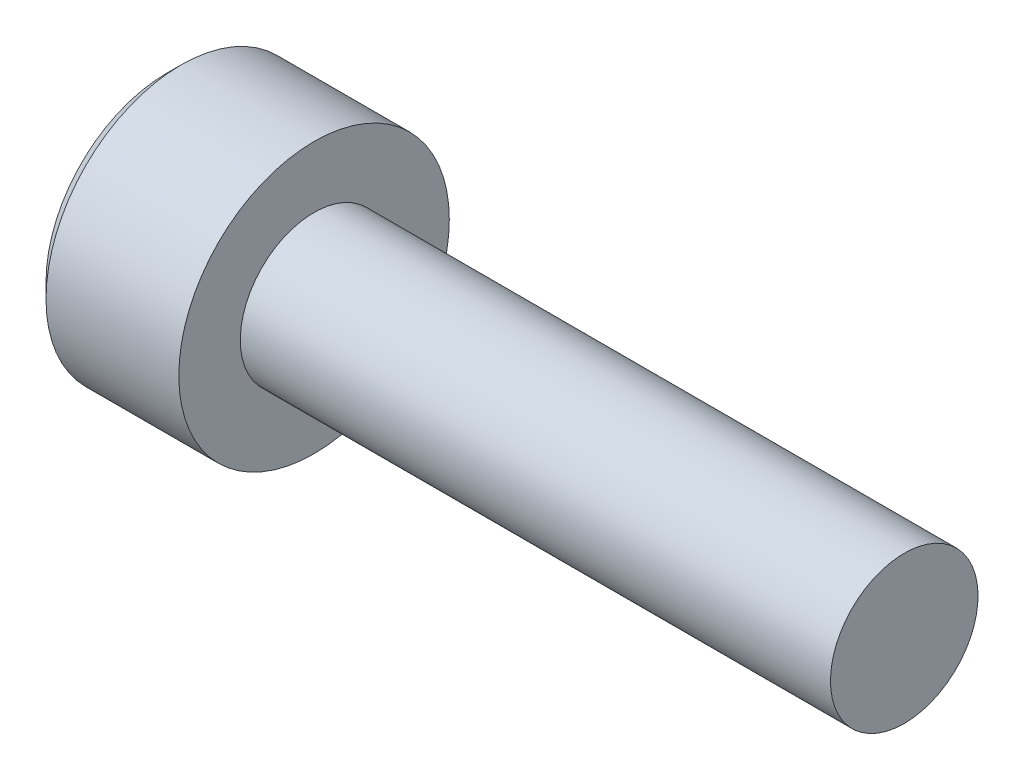
ISO-10303-21;
HEADER;
FILE_DESCRIPTION(('STEP AP214'),'2;1');
FILE_NAME('part.step','',(''),(''),'','','');
FILE_SCHEMA(('AUTOMOTIVE_DESIGN { 1 0 10303 214 1 1 1 1 }'));
ENDSEC;
DATA;
#1=APPLICATION_CONTEXT('core data for automotive mechanical design processes');
#2=APPLICATION_PROTOCOL_DEFINITION('international standard','automotive_design',2000,#1);
#3=PRODUCT_CONTEXT('',#1,'mechanical');
#4=PRODUCT('Part','Part','',(#3));
#5=PRODUCT_RELATED_PRODUCT_CATEGORY('part','',(#4));
#6=PRODUCT_DEFINITION_FORMATION('','',#4);
#7=PRODUCT_DEFINITION_CONTEXT('part definition',#1,'design');
#8=PRODUCT_DEFINITION('design','',#6,#7);
#9=PRODUCT_DEFINITION_SHAPE('','',#8);
#10=(LENGTH_UNIT() NAMED_UNIT(*) SI_UNIT(.MILLI.,.METRE.));
#11=(NAMED_UNIT(*) PLANE_ANGLE_UNIT() SI_UNIT($,.RADIAN.));
#12=(NAMED_UNIT(*) SI_UNIT($,.STERADIAN.) SOLID_ANGLE_UNIT());
#13=UNCERTAINTY_MEASURE_WITH_UNIT(LENGTH_MEASURE(1.E-05),#10,'distance_accuracy_value','');
#14=(GEOMETRIC_REPRESENTATION_CONTEXT(3) GLOBAL_UNCERTAINTY_ASSIGNED_CONTEXT((#13)) GLOBAL_UNIT_ASSIGNED_CONTEXT((#10,
#11,#12)) REPRESENTATION_CONTEXT('',''));
#15=CARTESIAN_POINT('',(0.,0.,0.));
#16=DIRECTION('',(0.,0.,1.));
#17=DIRECTION('',(1.,0.,0.));
#18=AXIS2_PLACEMENT_3D('',#15,#16,#17);
#19=CARTESIAN_POINT('',(-3.,0.,0.));
#20=DIRECTION('',(1.,0.,0.));
#21=DIRECTION('',(0.,1.,0.));
#22=AXIS2_PLACEMENT_3D('',#19,#20,#21);
#23=PLANE('',#22);
#24=CARTESIAN_POINT('',(-3.,0.,0.));
#25=DIRECTION('',(1.,0.,0.));
#26=DIRECTION('',(0.,1.,0.));
#27=AXIS2_PLACEMENT_3D('',#24,#25,#26);
#28=CIRCLE('',#27,2.45);
#29=CARTESIAN_POINT('',(-3.,2.45,0.));
#30=VERTEX_POINT('',#29);
#31=EDGE_CURVE('E45',#30,#30,#28,.F.);
#32=ORIENTED_EDGE('',*,*,#31,.T.);
#33=EDGE_LOOP('',(#32));
#34=FACE_BOUND('',#33,.T.);
#35=DIRECTION('',(0.,0.5,-0.866025403784439));
#36=VECTOR('',#35,1.);
#37=CARTESIAN_POINT('',(-3.,0.721687836487032,1.25));
#38=LINE('',#37,#36);
#39=CARTESIAN_POINT('',(-3.,0.721687836487031,1.25));
#40=VERTEX_POINT('',#39);
#41=CARTESIAN_POINT('',(-3.,1.44337567297406,0.));
#42=VERTEX_POINT('',#41);
#43=EDGE_CURVE('E150',#40,#42,#38,.T.);
#44=ORIENTED_EDGE('',*,*,#43,.F.);
#45=DIRECTION('',(0.,1.,0.));
#46=VECTOR('',#45,1.);
#47=CARTESIAN_POINT('',(-3.,-0.721687836487034,1.25));
#48=LINE('',#47,#46);
#49=CARTESIAN_POINT('',(-3.,-0.721687836487034,1.25));
#50=VERTEX_POINT('',#49);
#51=EDGE_CURVE('E123',#50,#40,#48,.T.);
#52=ORIENTED_EDGE('',*,*,#51,.F.);
#53=DIRECTION('',(0.,0.5,0.866025403784439));
#54=VECTOR('',#53,1.);
#55=CARTESIAN_POINT('',(-3.,-1.44337567297407,0.));
#56=LINE('',#55,#54);
#57=CARTESIAN_POINT('',(-3.,-1.44337567297407,0.));
#58=VERTEX_POINT('',#57);
#59=EDGE_CURVE('E119',#58,#50,#56,.T.);
#60=ORIENTED_EDGE('',*,*,#59,.F.);
#61=DIRECTION('',(0.,-0.5,0.866025403784439));
#62=VECTOR('',#61,1.);
#63=CARTESIAN_POINT('',(-3.,-0.721687836487033,-1.25));
#64=LINE('',#63,#62);
#65=CARTESIAN_POINT('',(-3.,-0.721687836487033,-1.25));
#66=VERTEX_POINT('',#65);
#67=EDGE_CURVE('E156',#66,#58,#64,.T.);
#68=ORIENTED_EDGE('',*,*,#67,.F.);
#69=DIRECTION('',(0.,-1.,0.));
#70=VECTOR('',#69,1.);
#71=CARTESIAN_POINT('',(-3.,0.721687836487032,-1.25));
#72=LINE('',#71,#70);
#73=CARTESIAN_POINT('',(-3.,0.721687836487032,-1.25));
#74=VERTEX_POINT('',#73);
#75=EDGE_CURVE('E154',#74,#66,#72,.T.);
#76=ORIENTED_EDGE('',*,*,#75,.F.);
#77=DIRECTION('',(0.,-0.5,-0.866025403784439));
#78=VECTOR('',#77,1.);
#79=CARTESIAN_POINT('',(-3.,1.44337567297406,0.));
#80=LINE('',#79,#78);
#81=EDGE_CURVE('E152',#42,#74,#80,.T.);
#82=ORIENTED_EDGE('',*,*,#81,.F.);
#83=EDGE_LOOP('',(#44,#52,#60,#68,#76,#82));
#84=FACE_BOUND('',#83,.T.);
#85=ADVANCED_FACE('F37',(#34,#84),#23,.F.);
#86=CARTESIAN_POINT('',(0.,1.5,0.));
#87=DIRECTION('',(-1.,0.,0.));
#88=DIRECTION('',(0.,-1.,0.));
#89=AXIS2_PLACEMENT_3D('',#86,#87,#88);
#90=PLANE('',#89);
#91=CARTESIAN_POINT('',(0.,0.,0.));
#92=DIRECTION('',(-1.,0.,0.));
#93=DIRECTION('',(0.,-1.,0.));
#94=AXIS2_PLACEMENT_3D('',#91,#92,#93);
#95=CIRCLE('',#94,2.75);
#96=CARTESIAN_POINT('',(0.,-2.75,0.));
#97=VERTEX_POINT('',#96);
#98=EDGE_CURVE('E182',#97,#97,#95,.T.);
#99=ORIENTED_EDGE('',*,*,#98,.F.);
#100=EDGE_LOOP('',(#99));
#101=FACE_BOUND('',#100,.T.);
#102=CARTESIAN_POINT('',(0.,0.,0.));
#103=DIRECTION('',(-1.,0.,0.));
#104=DIRECTION('',(0.,-1.,0.));
#105=AXIS2_PLACEMENT_3D('',#102,#103,#104);
#106=CIRCLE('',#105,1.5);
#107=CARTESIAN_POINT('',(0.,-1.5,0.));
#108=VERTEX_POINT('',#107);
#109=EDGE_CURVE('E176',#108,#108,#106,.T.);
#110=ORIENTED_EDGE('',*,*,#109,.T.);
#111=EDGE_LOOP('',(#110));
#112=FACE_BOUND('',#111,.T.);
#113=ADVANCED_FACE('F200',(#101,#112),#90,.F.);
#114=CARTESIAN_POINT('',(-3.,0.,0.));
#115=DIRECTION('',(-1.,0.,0.));
#116=DIRECTION('',(0.,-1.,0.));
#117=AXIS2_PLACEMENT_3D('',#114,#115,#116);
#118=CYLINDRICAL_SURFACE('',#117,2.75);
#119=CARTESIAN_POINT('',(-2.7,0.,0.));
#120=DIRECTION('',(1.,0.,0.));
#121=DIRECTION('',(0.,1.,0.));
#122=AXIS2_PLACEMENT_3D('',#119,#120,#121);
#123=CIRCLE('',#122,2.75);
#124=CARTESIAN_POINT('',(-2.7,2.75,0.));
#125=VERTEX_POINT('',#124);
#126=EDGE_CURVE('E11',#125,#125,#123,.T.);
#127=ORIENTED_EDGE('',*,*,#126,.T.);
#128=EDGE_LOOP('',(#127));
#129=FACE_BOUND('',#128,.T.);
#130=ORIENTED_EDGE('',*,*,#98,.T.);
#131=EDGE_LOOP('',(#130));
#132=FACE_BOUND('',#131,.T.);
#133=ADVANCED_FACE('F205',(#129,#132),#118,.T.);
#134=CARTESIAN_POINT('',(12.,1.5,0.));
#135=DIRECTION('',(-1.,0.,0.));
#136=DIRECTION('',(0.,-1.,0.));
#137=AXIS2_PLACEMENT_3D('',#134,#135,#136);
#138=PLANE('',#137);
#139=CARTESIAN_POINT('',(12.,0.,0.));
#140=DIRECTION('',(-1.,0.,0.));
#141=DIRECTION('',(0.,-1.,0.));
#142=AXIS2_PLACEMENT_3D('',#139,#140,#141);
#143=CIRCLE('',#142,1.5);
#144=CARTESIAN_POINT('',(12.,-1.5,0.));
#145=VERTEX_POINT('',#144);
#146=EDGE_CURVE('E179',#145,#145,#143,.T.);
#147=ORIENTED_EDGE('',*,*,#146,.F.);
#148=EDGE_LOOP('',(#147));
#149=FACE_BOUND('',#148,.T.);
#150=ADVANCED_FACE('F209',(#149),#138,.F.);
#151=CARTESIAN_POINT('',(-3.,0.,0.));
#152=DIRECTION('',(-1.,0.,0.));
#153=DIRECTION('',(0.,-1.,0.));
#154=AXIS2_PLACEMENT_3D('',#151,#152,#153);
#155=CYLINDRICAL_SURFACE('',#154,1.5);
#156=ORIENTED_EDGE('',*,*,#109,.F.);
#157=EDGE_LOOP('',(#156));
#158=FACE_BOUND('',#157,.T.);
#159=ORIENTED_EDGE('',*,*,#146,.T.);
#160=EDGE_LOOP('',(#159));
#161=FACE_BOUND('',#160,.T.);
#162=ADVANCED_FACE('F216',(#158,#161),#155,.T.);
#163=CARTESIAN_POINT('',(-1.7,-0.721687836487034,1.25));
#164=DIRECTION('',(0.,0.,1.));
#165=DIRECTION('',(0.,-1.,0.));
#166=AXIS2_PLACEMENT_3D('',#163,#164,#165);
#167=PLANE('',#166);
#168=DIRECTION('',(0.,1.,0.));
#169=VECTOR('',#168,1.);
#170=CARTESIAN_POINT('',(-1.7,-0.721687836487034,1.25));
#171=LINE('',#170,#169);
#172=CARTESIAN_POINT('',(-1.7,-0.721687836487034,1.25));
#173=VERTEX_POINT('',#172);
#174=CARTESIAN_POINT('',(-1.7,0.,1.25));
#175=VERTEX_POINT('',#174);
#176=EDGE_CURVE('E60',#173,#175,#171,.T.);
#177=ORIENTED_EDGE('',*,*,#176,.F.);
#178=DIRECTION('',(-1.,0.,0.));
#179=VECTOR('',#178,1.);
#180=CARTESIAN_POINT('',(-1.7,-0.721687836487034,1.25));
#181=LINE('',#180,#179);
#182=EDGE_CURVE('E160',#173,#50,#181,.T.);
#183=ORIENTED_EDGE('',*,*,#182,.T.);
#184=ORIENTED_EDGE('',*,*,#51,.T.);
#185=DIRECTION('',(-1.,0.,0.));
#186=VECTOR('',#185,1.);
#187=CARTESIAN_POINT('',(-1.7,0.721687836487032,1.25));
#188=LINE('',#187,#186);
#189=CARTESIAN_POINT('',(-1.7,0.721687836487032,1.25));
#190=VERTEX_POINT('',#189);
#191=EDGE_CURVE('E52',#190,#40,#188,.T.);
#192=ORIENTED_EDGE('',*,*,#191,.F.);
#193=EDGE_CURVE('E112',#175,#190,#171,.T.);
#194=ORIENTED_EDGE('',*,*,#193,.F.);
#195=EDGE_LOOP('',(#177,#183,#184,#192,#194));
#196=FACE_BOUND('',#195,.T.);
#197=ADVANCED_FACE('F121',(#196),#167,.F.);
#198=CARTESIAN_POINT('',(-1.7,-1.44337567297407,0.));
#199=DIRECTION('',(0.,-0.866025403784439,0.5));
#200=DIRECTION('',(0.,-0.5,-0.866025403784439));
#201=AXIS2_PLACEMENT_3D('',#198,#199,#200);
#202=PLANE('',#201);
#203=DIRECTION('',(0.,0.5,0.866025403784439));
#204=VECTOR('',#203,1.);
#205=CARTESIAN_POINT('',(-1.7,-1.44337567297407,0.));
#206=LINE('',#205,#204);
#207=CARTESIAN_POINT('',(-1.7,-1.44337567297407,0.));
#208=VERTEX_POINT('',#207);
#209=CARTESIAN_POINT('',(-1.7,-1.08253175473055,0.625000000000001));
#210=VERTEX_POINT('',#209);
#211=EDGE_CURVE('E126',#208,#210,#206,.T.);
#212=ORIENTED_EDGE('',*,*,#211,.F.);
#213=DIRECTION('',(-1.,0.,0.));
#214=VECTOR('',#213,1.);
#215=CARTESIAN_POINT('',(-1.7,-1.44337567297407,0.));
#216=LINE('',#215,#214);
#217=EDGE_CURVE('E163',#208,#58,#216,.T.);
#218=ORIENTED_EDGE('',*,*,#217,.T.);
#219=ORIENTED_EDGE('',*,*,#59,.T.);
#220=ORIENTED_EDGE('',*,*,#182,.F.);
#221=EDGE_CURVE('E146',#210,#173,#206,.T.);
#222=ORIENTED_EDGE('',*,*,#221,.F.);
#223=EDGE_LOOP('',(#212,#218,#219,#220,#222));
#224=FACE_BOUND('',#223,.T.);
#225=ADVANCED_FACE('F229',(#224),#202,.F.);
#226=CARTESIAN_POINT('',(-1.7,-0.721687836487033,-1.25));
#227=DIRECTION('',(0.,-0.866025403784439,-0.5));
#228=DIRECTION('',(0.,0.5,-0.866025403784439));
#229=AXIS2_PLACEMENT_3D('',#226,#227,#228);
#230=PLANE('',#229);
#231=DIRECTION('',(0.,-0.5,0.866025403784439));
#232=VECTOR('',#231,1.);
#233=CARTESIAN_POINT('',(-1.7,-0.721687836487033,-1.25));
#234=LINE('',#233,#232);
#235=CARTESIAN_POINT('',(-1.7,-0.721687836487033,-1.25));
#236=VERTEX_POINT('',#235);
#237=CARTESIAN_POINT('',(-1.7,-1.08253175473055,-0.625));
#238=VERTEX_POINT('',#237);
#239=EDGE_CURVE('E143',#236,#238,#234,.T.);
#240=ORIENTED_EDGE('',*,*,#239,.F.);
#241=DIRECTION('',(-1.,0.,0.));
#242=VECTOR('',#241,1.);
#243=CARTESIAN_POINT('',(-1.7,-0.721687836487033,-1.25));
#244=LINE('',#243,#242);
#245=EDGE_CURVE('E166',#236,#66,#244,.T.);
#246=ORIENTED_EDGE('',*,*,#245,.T.);
#247=ORIENTED_EDGE('',*,*,#67,.T.);
#248=ORIENTED_EDGE('',*,*,#217,.F.);
#249=EDGE_CURVE('E142',#238,#208,#234,.T.);
#250=ORIENTED_EDGE('',*,*,#249,.F.);
#251=EDGE_LOOP('',(#240,#246,#247,#248,#250));
#252=FACE_BOUND('',#251,.T.);
#253=ADVANCED_FACE('F241',(#252),#230,.F.);
#254=CARTESIAN_POINT('',(-1.7,0.721687836487032,-1.25));
#255=DIRECTION('',(0.,0.,-1.));
#256=DIRECTION('',(-1.,0.,0.));
#257=AXIS2_PLACEMENT_3D('',#254,#255,#256);
#258=PLANE('',#257);
#259=DIRECTION('',(0.,-1.,0.));
#260=VECTOR('',#259,1.);
#261=CARTESIAN_POINT('',(-1.7,0.721687836487032,-1.25));
#262=LINE('',#261,#260);
#263=CARTESIAN_POINT('',(-1.7,0.721687836487032,-1.25));
#264=VERTEX_POINT('',#263);
#265=CARTESIAN_POINT('',(-1.7,0.,-1.25));
#266=VERTEX_POINT('',#265);
#267=EDGE_CURVE('E139',#264,#266,#262,.T.);
#268=ORIENTED_EDGE('',*,*,#267,.F.);
#269=DIRECTION('',(-1.,0.,0.));
#270=VECTOR('',#269,1.);
#271=CARTESIAN_POINT('',(-1.7,0.721687836487032,-1.25));
#272=LINE('',#271,#270);
#273=EDGE_CURVE('E169',#264,#74,#272,.T.);
#274=ORIENTED_EDGE('',*,*,#273,.T.);
#275=ORIENTED_EDGE('',*,*,#75,.T.);
#276=ORIENTED_EDGE('',*,*,#245,.F.);
#277=EDGE_CURVE('E138',#266,#236,#262,.T.);
#278=ORIENTED_EDGE('',*,*,#277,.F.);
#279=EDGE_LOOP('',(#268,#274,#275,#276,#278));
#280=FACE_BOUND('',#279,.T.);
#281=ADVANCED_FACE('F237',(#280),#258,.F.);
#282=CARTESIAN_POINT('',(-1.7,1.44337567297406,0.));
#283=DIRECTION('',(0.,0.866025403784439,-0.5));
#284=DIRECTION('',(0.,0.5,0.866025403784439));
#285=AXIS2_PLACEMENT_3D('',#282,#283,#284);
#286=PLANE('',#285);
#287=DIRECTION('',(0.,-0.5,-0.866025403784439));
#288=VECTOR('',#287,1.);
#289=CARTESIAN_POINT('',(-1.7,1.44337567297406,0.));
#290=LINE('',#289,#288);
#291=CARTESIAN_POINT('',(-1.7,1.44337567297406,0.));
#292=VERTEX_POINT('',#291);
#293=CARTESIAN_POINT('',(-1.7,1.08253175473055,-0.625));
#294=VERTEX_POINT('',#293);
#295=EDGE_CURVE('E134',#292,#294,#290,.T.);
#296=ORIENTED_EDGE('',*,*,#295,.F.);
#297=DIRECTION('',(-1.,0.,0.));
#298=VECTOR('',#297,1.);
#299=CARTESIAN_POINT('',(-1.7,1.44337567297406,0.));
#300=LINE('',#299,#298);
#301=EDGE_CURVE('E125',#292,#42,#300,.T.);
#302=ORIENTED_EDGE('',*,*,#301,.T.);
#303=ORIENTED_EDGE('',*,*,#81,.T.);
#304=ORIENTED_EDGE('',*,*,#273,.F.);
#305=EDGE_CURVE('E132',#294,#264,#290,.T.);
#306=ORIENTED_EDGE('',*,*,#305,.F.);
#307=EDGE_LOOP('',(#296,#302,#303,#304,#306));
#308=FACE_BOUND('',#307,.T.);
#309=ADVANCED_FACE('F234',(#308),#286,.F.);
#310=CARTESIAN_POINT('',(-1.7,0.721687836487032,1.25));
#311=DIRECTION('',(0.,0.866025403784439,0.5));
#312=DIRECTION('',(0.,-0.5,0.866025403784439));
#313=AXIS2_PLACEMENT_3D('',#310,#311,#312);
#314=PLANE('',#313);
#315=DIRECTION('',(0.,0.5,-0.866025403784439));
#316=VECTOR('',#315,1.);
#317=CARTESIAN_POINT('',(-1.7,0.721687836487032,1.25));
#318=LINE('',#317,#316);
#319=CARTESIAN_POINT('',(-1.7,1.08253175473055,0.625));
#320=VERTEX_POINT('',#319);
#321=EDGE_CURVE('E114',#190,#320,#318,.T.);
#322=ORIENTED_EDGE('',*,*,#321,.F.);
#323=ORIENTED_EDGE('',*,*,#191,.T.);
#324=ORIENTED_EDGE('',*,*,#43,.T.);
#325=ORIENTED_EDGE('',*,*,#301,.F.);
#326=EDGE_CURVE('E131',#320,#292,#318,.T.);
#327=ORIENTED_EDGE('',*,*,#326,.F.);
#328=EDGE_LOOP('',(#322,#323,#324,#325,#327));
#329=FACE_BOUND('',#328,.T.);
#330=ADVANCED_FACE('F129',(#329),#314,.F.);
#331=CARTESIAN_POINT('',(-1.7,0.,0.));
#332=DIRECTION('',(-1.,0.,0.));
#333=DIRECTION('',(0.,0.,1.));
#334=AXIS2_PLACEMENT_3D('',#331,#332,#333);
#335=PLANE('',#334);
#336=ORIENTED_EDGE('',*,*,#193,.T.);
#337=ORIENTED_EDGE('',*,*,#321,.T.);
#338=CARTESIAN_POINT('',(-1.7,0.,0.));
#339=DIRECTION('',(-1.,0.,0.));
#340=DIRECTION('',(0.,-1.,0.));
#341=AXIS2_PLACEMENT_3D('',#338,#339,#340);
#342=CIRCLE('',#341,1.25);
#343=EDGE_CURVE('E116',#175,#320,#342,.T.);
#344=ORIENTED_EDGE('',*,*,#343,.F.);
#345=EDGE_LOOP('',(#336,#337,#344));
#346=FACE_BOUND('',#345,.T.);
#347=ADVANCED_FACE('F113',(#346),#335,.T.);
#348=ORIENTED_EDGE('',*,*,#326,.T.);
#349=ORIENTED_EDGE('',*,*,#295,.T.);
#350=EDGE_CURVE('E269',#320,#294,#342,.T.);
#351=ORIENTED_EDGE('',*,*,#350,.F.);
#352=EDGE_LOOP('',(#348,#349,#351));
#353=FACE_BOUND('',#352,.T.);
#354=ADVANCED_FACE('F257',(#353),#335,.T.);
#355=ORIENTED_EDGE('',*,*,#305,.T.);
#356=ORIENTED_EDGE('',*,*,#267,.T.);
#357=EDGE_CURVE('E275',#294,#266,#342,.T.);
#358=ORIENTED_EDGE('',*,*,#357,.F.);
#359=EDGE_LOOP('',(#355,#356,#358));
#360=FACE_BOUND('',#359,.T.);
#361=ADVANCED_FACE('F261',(#360),#335,.T.);
#362=ORIENTED_EDGE('',*,*,#277,.T.);
#363=ORIENTED_EDGE('',*,*,#239,.T.);
#364=EDGE_CURVE('E277',#266,#238,#342,.T.);
#365=ORIENTED_EDGE('',*,*,#364,.F.);
#366=EDGE_LOOP('',(#362,#363,#365));
#367=FACE_BOUND('',#366,.T.);
#368=ADVANCED_FACE('F254',(#367),#335,.T.);
#369=ORIENTED_EDGE('',*,*,#249,.T.);
#370=ORIENTED_EDGE('',*,*,#211,.T.);
#371=EDGE_CURVE('E162',#238,#210,#342,.T.);
#372=ORIENTED_EDGE('',*,*,#371,.F.);
#373=EDGE_LOOP('',(#369,#370,#372));
#374=FACE_BOUND('',#373,.T.);
#375=ADVANCED_FACE('F250',(#374),#335,.T.);
#376=ORIENTED_EDGE('',*,*,#221,.T.);
#377=ORIENTED_EDGE('',*,*,#176,.T.);
#378=EDGE_CURVE('E174',#210,#175,#342,.T.);
#379=ORIENTED_EDGE('',*,*,#378,.F.);
#380=EDGE_LOOP('',(#376,#377,#379));
#381=FACE_BOUND('',#380,.T.);
#382=ADVANCED_FACE('F195',(#381),#335,.T.);
#383=CARTESIAN_POINT('',(-0.948924226215541,0.,0.));
#384=DIRECTION('',(-1.,0.,0.));
#385=DIRECTION('',(0.,-1.,0.));
#386=AXIS2_PLACEMENT_3D('',#383,#384,#385);
#387=CONICAL_SURFACE('',#386,0.,1.02974425867665);
#388=ORIENTED_EDGE('',*,*,#378,.T.);
#389=ORIENTED_EDGE('',*,*,#343,.T.);
#390=ORIENTED_EDGE('',*,*,#350,.T.);
#391=ORIENTED_EDGE('',*,*,#357,.T.);
#392=ORIENTED_EDGE('',*,*,#364,.T.);
#393=ORIENTED_EDGE('',*,*,#371,.T.);
#394=EDGE_LOOP('',(#388,#389,#390,#391,#392,#393));
#395=FACE_BOUND('',#394,.T.);
#396=CARTESIAN_POINT('',(-0.948924226215541,0.,0.));
#397=VERTEX_POINT('',#396);
#398=VERTEX_LOOP('',#397);
#399=FACE_BOUND('',#398,.T.);
#400=ADVANCED_FACE('F190',(#395,#399),#387,.F.);
#401=CARTESIAN_POINT('',(-3.,0.,0.));
#402=DIRECTION('',(1.,0.,0.));
#403=DIRECTION('',(0.,1.,0.));
#404=AXIS2_PLACEMENT_3D('',#401,#402,#403);
#405=CONICAL_SURFACE('',#404,2.45,0.78539816339745);
#406=ORIENTED_EDGE('',*,*,#126,.F.);
#407=EDGE_LOOP('',(#406));
#408=FACE_BOUND('',#407,.T.);
#409=ORIENTED_EDGE('',*,*,#31,.F.);
#410=EDGE_LOOP('',(#409));
#411=FACE_BOUND('',#410,.T.);
#412=ADVANCED_FACE('F39',(#408,#411),#405,.T.);
#413=CLOSED_SHELL('',(#85,#113,#133,#150,#162,#197,#225,#253,#281,#309,#330,#347,#354,#361,#368,
#375,#382,#400,#412));
#414=MANIFOLD_SOLID_BREP('B2',#413);
#415=ADVANCED_BREP_SHAPE_REPRESENTATION('',(#18,#414),#14);
#416=SHAPE_DEFINITION_REPRESENTATION(#9,#415);
ENDSEC;
END-ISO-10303-21;
